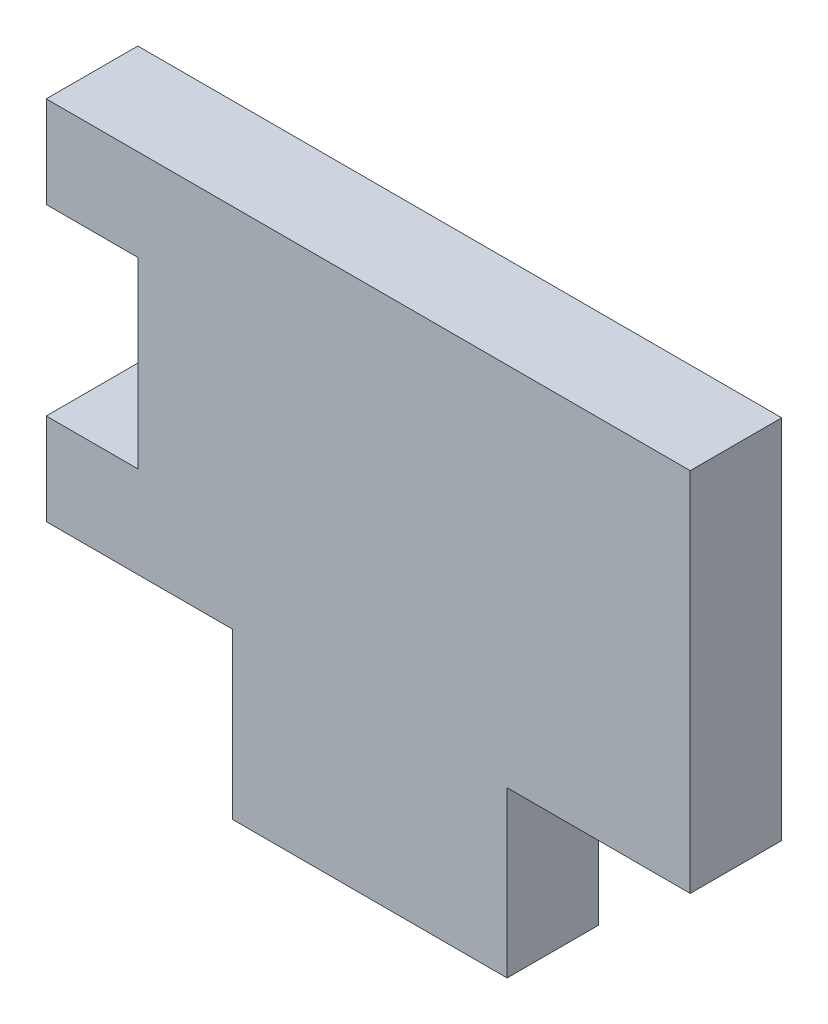
ISO-10303-21;
HEADER;
FILE_DESCRIPTION(('STEP AP214'),'2;1');
FILE_NAME('part.step','',(''),(''),'','','');
FILE_SCHEMA(('AUTOMOTIVE_DESIGN { 1 0 10303 214 1 1 1 1 }'));
ENDSEC;
DATA;
#1=APPLICATION_CONTEXT('core data for automotive mechanical design processes');
#2=APPLICATION_PROTOCOL_DEFINITION('international standard','automotive_design',2000,#1);
#3=PRODUCT_CONTEXT('',#1,'mechanical');
#4=PRODUCT('Part','Part','',(#3));
#5=PRODUCT_RELATED_PRODUCT_CATEGORY('part','',(#4));
#6=PRODUCT_DEFINITION_FORMATION('','',#4);
#7=PRODUCT_DEFINITION_CONTEXT('part definition',#1,'design');
#8=PRODUCT_DEFINITION('design','',#6,#7);
#9=PRODUCT_DEFINITION_SHAPE('','',#8);
#10=(LENGTH_UNIT() NAMED_UNIT(*) SI_UNIT(.MILLI.,.METRE.));
#11=(NAMED_UNIT(*) PLANE_ANGLE_UNIT() SI_UNIT($,.RADIAN.));
#12=(NAMED_UNIT(*) SI_UNIT($,.STERADIAN.) SOLID_ANGLE_UNIT());
#13=UNCERTAINTY_MEASURE_WITH_UNIT(LENGTH_MEASURE(1.E-05),#10,'distance_accuracy_value','');
#14=(GEOMETRIC_REPRESENTATION_CONTEXT(3) GLOBAL_UNCERTAINTY_ASSIGNED_CONTEXT((#13)) GLOBAL_UNIT_ASSIGNED_CONTEXT((#10,
#11,#12)) REPRESENTATION_CONTEXT('',''));
#15=CARTESIAN_POINT('',(0.,0.,0.));
#16=DIRECTION('',(0.,0.,1.));
#17=DIRECTION('',(1.,0.,0.));
#18=AXIS2_PLACEMENT_3D('',#15,#16,#17);
#19=CARTESIAN_POINT('',(34.9999999999996,2.93744717172161,5.));
#20=DIRECTION('',(-1.,0.,0.));
#21=DIRECTION('',(0.,0.,1.));
#22=AXIS2_PLACEMENT_3D('',#19,#20,#21);
#23=PLANE('',#22);
#24=DIRECTION('',(0.,1.,0.));
#25=VECTOR('',#24,1.);
#26=CARTESIAN_POINT('',(34.9999999999996,2.93744717172161,0.));
#27=LINE('',#26,#25);
#28=CARTESIAN_POINT('',(34.9999999999996,2.93744717172161,0.));
#29=VERTEX_POINT('',#28);
#30=CARTESIAN_POINT('',(34.9999999999996,22.9374471717216,0.));
#31=VERTEX_POINT('',#30);
#32=EDGE_CURVE('E165',#29,#31,#27,.T.);
#33=ORIENTED_EDGE('',*,*,#32,.T.);
#34=DIRECTION('',(0.,0.,-1.));
#35=VECTOR('',#34,1.);
#36=CARTESIAN_POINT('',(34.9999999999996,22.9374471717216,5.));
#37=LINE('',#36,#35);
#38=CARTESIAN_POINT('',(34.9999999999996,22.9374471717216,5.));
#39=VERTEX_POINT('',#38);
#40=EDGE_CURVE('E11',#39,#31,#37,.T.);
#41=ORIENTED_EDGE('',*,*,#40,.F.);
#42=DIRECTION('',(0.,1.,0.));
#43=VECTOR('',#42,1.);
#44=CARTESIAN_POINT('',(34.9999999999996,2.93744717172161,5.));
#45=LINE('',#44,#43);
#46=CARTESIAN_POINT('',(34.9999999999996,2.93744717172161,5.));
#47=VERTEX_POINT('',#46);
#48=EDGE_CURVE('E188',#47,#39,#45,.T.);
#49=ORIENTED_EDGE('',*,*,#48,.F.);
#50=DIRECTION('',(0.,0.,-1.));
#51=VECTOR('',#50,1.);
#52=CARTESIAN_POINT('',(34.9999999999996,2.93744717172161,5.));
#53=LINE('',#52,#51);
#54=EDGE_CURVE('E161',#47,#29,#53,.T.);
#55=ORIENTED_EDGE('',*,*,#54,.T.);
#56=EDGE_LOOP('',(#33,#41,#49,#55));
#57=FACE_BOUND('',#56,.T.);
#58=ADVANCED_FACE('F45',(#57),#23,.F.);
#59=CARTESIAN_POINT('',(-0.17398532670764,22.9374471717216,5.));
#60=DIRECTION('',(0.,-1.,0.));
#61=DIRECTION('',(0.,0.,-1.));
#62=AXIS2_PLACEMENT_3D('',#59,#60,#61);
#63=PLANE('',#62);
#64=DIRECTION('',(-1.,0.,0.));
#65=VECTOR('',#64,1.);
#66=CARTESIAN_POINT('',(-0.17398532670764,22.9374471717216,0.));
#67=LINE('',#66,#65);
#68=CARTESIAN_POINT('',(-0.17398532670764,22.9374471717216,0.));
#69=VERTEX_POINT('',#68);
#70=EDGE_CURVE('E168',#31,#69,#67,.T.);
#71=ORIENTED_EDGE('',*,*,#70,.T.);
#72=DIRECTION('',(0.,0.,-1.));
#73=VECTOR('',#72,1.);
#74=CARTESIAN_POINT('',(-0.17398532670764,22.9374471717216,5.));
#75=LINE('',#74,#73);
#76=CARTESIAN_POINT('',(-0.17398532670764,22.9374471717216,5.));
#77=VERTEX_POINT('',#76);
#78=EDGE_CURVE('E53',#77,#69,#75,.T.);
#79=ORIENTED_EDGE('',*,*,#78,.F.);
#80=DIRECTION('',(-1.,0.,0.));
#81=VECTOR('',#80,1.);
#82=CARTESIAN_POINT('',(-0.17398532670764,22.9374471717216,5.));
#83=LINE('',#82,#81);
#84=EDGE_CURVE('E116',#39,#77,#83,.T.);
#85=ORIENTED_EDGE('',*,*,#84,.F.);
#86=ORIENTED_EDGE('',*,*,#40,.T.);
#87=EDGE_LOOP('',(#71,#79,#85,#86));
#88=FACE_BOUND('',#87,.T.);
#89=ADVANCED_FACE('F265',(#88),#63,.F.);
#90=CARTESIAN_POINT('',(-0.17398532670764,17.9374471717216,5.));
#91=DIRECTION('',(1.,0.,0.));
#92=DIRECTION('',(0.,0.,-1.));
#93=AXIS2_PLACEMENT_3D('',#90,#91,#92);
#94=PLANE('',#93);
#95=DIRECTION('',(0.,-1.,0.));
#96=VECTOR('',#95,1.);
#97=CARTESIAN_POINT('',(-0.17398532670764,17.9374471717216,0.));
#98=LINE('',#97,#96);
#99=CARTESIAN_POINT('',(-0.17398532670764,17.9374471717216,0.));
#100=VERTEX_POINT('',#99);
#101=EDGE_CURVE('E170',#69,#100,#98,.T.);
#102=ORIENTED_EDGE('',*,*,#101,.T.);
#103=DIRECTION('',(0.,0.,-1.));
#104=VECTOR('',#103,1.);
#105=CARTESIAN_POINT('',(-0.17398532670764,17.9374471717216,5.));
#106=LINE('',#105,#104);
#107=CARTESIAN_POINT('',(-0.17398532670764,17.9374471717216,5.));
#108=VERTEX_POINT('',#107);
#109=EDGE_CURVE('E207',#108,#100,#106,.T.);
#110=ORIENTED_EDGE('',*,*,#109,.F.);
#111=DIRECTION('',(0.,-1.,0.));
#112=VECTOR('',#111,1.);
#113=CARTESIAN_POINT('',(-0.17398532670764,17.9374471717216,5.));
#114=LINE('',#113,#112);
#115=EDGE_CURVE('E215',#77,#108,#114,.T.);
#116=ORIENTED_EDGE('',*,*,#115,.F.);
#117=ORIENTED_EDGE('',*,*,#78,.T.);
#118=EDGE_LOOP('',(#102,#110,#116,#117));
#119=FACE_BOUND('',#118,.T.);
#120=ADVANCED_FACE('F213',(#119),#94,.F.);
#121=CARTESIAN_POINT('',(4.82601467329236,17.9374471717216,5.));
#122=DIRECTION('',(0.,1.,0.));
#123=DIRECTION('',(0.,0.,1.));
#124=AXIS2_PLACEMENT_3D('',#121,#122,#123);
#125=PLANE('',#124);
#126=DIRECTION('',(1.,0.,0.));
#127=VECTOR('',#126,1.);
#128=CARTESIAN_POINT('',(4.82601467329236,17.9374471717216,0.));
#129=LINE('',#128,#127);
#130=CARTESIAN_POINT('',(4.82601467329236,17.9374471717216,0.));
#131=VERTEX_POINT('',#130);
#132=EDGE_CURVE('E172',#100,#131,#129,.T.);
#133=ORIENTED_EDGE('',*,*,#132,.T.);
#134=DIRECTION('',(0.,0.,-1.));
#135=VECTOR('',#134,1.);
#136=CARTESIAN_POINT('',(4.82601467329236,17.9374471717216,5.));
#137=LINE('',#136,#135);
#138=CARTESIAN_POINT('',(4.82601467329236,17.9374471717216,5.));
#139=VERTEX_POINT('',#138);
#140=EDGE_CURVE('E204',#139,#131,#137,.T.);
#141=ORIENTED_EDGE('',*,*,#140,.F.);
#142=DIRECTION('',(1.,0.,0.));
#143=VECTOR('',#142,1.);
#144=CARTESIAN_POINT('',(4.82601467329236,17.9374471717216,5.));
#145=LINE('',#144,#143);
#146=EDGE_CURVE('E232',#108,#139,#145,.T.);
#147=ORIENTED_EDGE('',*,*,#146,.F.);
#148=ORIENTED_EDGE('',*,*,#109,.T.);
#149=EDGE_LOOP('',(#133,#141,#147,#148));
#150=FACE_BOUND('',#149,.T.);
#151=ADVANCED_FACE('F223',(#150),#125,.F.);
#152=CARTESIAN_POINT('',(4.82601467329236,7.93744717172161,5.));
#153=DIRECTION('',(1.,0.,0.));
#154=DIRECTION('',(0.,1.,0.));
#155=AXIS2_PLACEMENT_3D('',#152,#153,#154);
#156=PLANE('',#155);
#157=DIRECTION('',(0.,-1.,0.));
#158=VECTOR('',#157,1.);
#159=CARTESIAN_POINT('',(4.82601467329236,7.93744717172161,0.));
#160=LINE('',#159,#158);
#161=CARTESIAN_POINT('',(4.82601467329236,7.93744717172161,0.));
#162=VERTEX_POINT('',#161);
#163=EDGE_CURVE('E175',#131,#162,#160,.T.);
#164=ORIENTED_EDGE('',*,*,#163,.T.);
#165=DIRECTION('',(0.,0.,-1.));
#166=VECTOR('',#165,1.);
#167=CARTESIAN_POINT('',(4.82601467329236,7.93744717172161,5.));
#168=LINE('',#167,#166);
#169=CARTESIAN_POINT('',(4.82601467329236,7.93744717172161,5.));
#170=VERTEX_POINT('',#169);
#171=EDGE_CURVE('E201',#170,#162,#168,.T.);
#172=ORIENTED_EDGE('',*,*,#171,.F.);
#173=DIRECTION('',(0.,-1.,0.));
#174=VECTOR('',#173,1.);
#175=CARTESIAN_POINT('',(4.82601467329236,17.9374471717216,5.));
#176=LINE('',#175,#174);
#177=EDGE_CURVE('E229',#139,#170,#176,.T.);
#178=ORIENTED_EDGE('',*,*,#177,.F.);
#179=ORIENTED_EDGE('',*,*,#140,.T.);
#180=EDGE_LOOP('',(#164,#172,#178,#179));
#181=FACE_BOUND('',#180,.T.);
#182=ADVANCED_FACE('F227',(#181),#156,.F.);
#183=CARTESIAN_POINT('',(4.82601467329236,7.93744717172161,5.));
#184=DIRECTION('',(0.,-1.,0.));
#185=DIRECTION('',(0.,0.,-1.));
#186=AXIS2_PLACEMENT_3D('',#183,#184,#185);
#187=PLANE('',#186);
#188=DIRECTION('',(-1.,0.,0.));
#189=VECTOR('',#188,1.);
#190=CARTESIAN_POINT('',(4.82601467329236,7.93744717172161,0.));
#191=LINE('',#190,#189);
#192=CARTESIAN_POINT('',(-0.17398532670764,7.93744717172161,0.));
#193=VERTEX_POINT('',#192);
#194=EDGE_CURVE('E177',#162,#193,#191,.T.);
#195=ORIENTED_EDGE('',*,*,#194,.T.);
#196=DIRECTION('',(0.,0.,-1.));
#197=VECTOR('',#196,1.);
#198=CARTESIAN_POINT('',(-0.17398532670764,7.93744717172161,5.));
#199=LINE('',#198,#197);
#200=CARTESIAN_POINT('',(-0.17398532670764,7.93744717172161,5.));
#201=VERTEX_POINT('',#200);
#202=EDGE_CURVE('E198',#201,#193,#199,.T.);
#203=ORIENTED_EDGE('',*,*,#202,.F.);
#204=DIRECTION('',(-1.,0.,0.));
#205=VECTOR('',#204,1.);
#206=CARTESIAN_POINT('',(4.82601467329236,7.93744717172161,5.));
#207=LINE('',#206,#205);
#208=EDGE_CURVE('E231',#170,#201,#207,.T.);
#209=ORIENTED_EDGE('',*,*,#208,.F.);
#210=ORIENTED_EDGE('',*,*,#171,.T.);
#211=EDGE_LOOP('',(#195,#203,#209,#210));
#212=FACE_BOUND('',#211,.T.);
#213=ADVANCED_FACE('F278',(#212),#187,.F.);
#214=CARTESIAN_POINT('',(-0.17398532670764,2.93744717172161,5.));
#215=DIRECTION('',(1.,0.,0.));
#216=DIRECTION('',(0.,0.,-1.));
#217=AXIS2_PLACEMENT_3D('',#214,#215,#216);
#218=PLANE('',#217);
#219=DIRECTION('',(0.,-1.,0.));
#220=VECTOR('',#219,1.);
#221=CARTESIAN_POINT('',(-0.17398532670764,2.93744717172161,0.));
#222=LINE('',#221,#220);
#223=CARTESIAN_POINT('',(-0.17398532670764,2.93744717172161,0.));
#224=VERTEX_POINT('',#223);
#225=EDGE_CURVE('E179',#193,#224,#222,.T.);
#226=ORIENTED_EDGE('',*,*,#225,.T.);
#227=DIRECTION('',(0.,0.,-1.));
#228=VECTOR('',#227,1.);
#229=CARTESIAN_POINT('',(-0.17398532670764,2.93744717172161,5.));
#230=LINE('',#229,#228);
#231=CARTESIAN_POINT('',(-0.17398532670764,2.93744717172161,5.));
#232=VERTEX_POINT('',#231);
#233=EDGE_CURVE('E195',#232,#224,#230,.T.);
#234=ORIENTED_EDGE('',*,*,#233,.F.);
#235=DIRECTION('',(0.,-1.,0.));
#236=VECTOR('',#235,1.);
#237=CARTESIAN_POINT('',(-0.17398532670764,2.93744717172161,5.));
#238=LINE('',#237,#236);
#239=EDGE_CURVE('E234',#201,#232,#238,.T.);
#240=ORIENTED_EDGE('',*,*,#239,.F.);
#241=ORIENTED_EDGE('',*,*,#202,.T.);
#242=EDGE_LOOP('',(#226,#234,#240,#241));
#243=FACE_BOUND('',#242,.T.);
#244=ADVANCED_FACE('F281',(#243),#218,.F.);
#245=CARTESIAN_POINT('',(-0.17398532670764,2.93744717172161,5.));
#246=DIRECTION('',(0.,1.,0.));
#247=DIRECTION('',(0.,0.,1.));
#248=AXIS2_PLACEMENT_3D('',#245,#246,#247);
#249=PLANE('',#248);
#250=DIRECTION('',(1.,0.,0.));
#251=VECTOR('',#250,1.);
#252=CARTESIAN_POINT('',(-0.17398532670764,2.93744717172161,0.));
#253=LINE('',#252,#251);
#254=CARTESIAN_POINT('',(9.99999999999963,2.93744717172161,0.));
#255=VERTEX_POINT('',#254);
#256=EDGE_CURVE('E181',#224,#255,#253,.T.);
#257=ORIENTED_EDGE('',*,*,#256,.T.);
#258=DIRECTION('',(0.,0.,-1.));
#259=VECTOR('',#258,1.);
#260=CARTESIAN_POINT('',(9.99999999999963,2.93744717172161,5.));
#261=LINE('',#260,#259);
#262=CARTESIAN_POINT('',(9.99999999999963,2.93744717172161,5.));
#263=VERTEX_POINT('',#262);
#264=EDGE_CURVE('E192',#263,#255,#261,.T.);
#265=ORIENTED_EDGE('',*,*,#264,.F.);
#266=DIRECTION('',(1.,0.,0.));
#267=VECTOR('',#266,1.);
#268=CARTESIAN_POINT('',(-0.17398532670764,2.93744717172161,5.));
#269=LINE('',#268,#267);
#270=EDGE_CURVE('E240',#232,#263,#269,.T.);
#271=ORIENTED_EDGE('',*,*,#270,.F.);
#272=ORIENTED_EDGE('',*,*,#233,.T.);
#273=EDGE_LOOP('',(#257,#265,#271,#272));
#274=FACE_BOUND('',#273,.T.);
#275=ADVANCED_FACE('F246',(#274),#249,.F.);
#276=CARTESIAN_POINT('',(9.99999999999963,2.93744717172161,5.));
#277=DIRECTION('',(1.,0.,0.));
#278=DIRECTION('',(0.,1.,0.));
#279=AXIS2_PLACEMENT_3D('',#276,#277,#278);
#280=PLANE('',#279);
#281=DIRECTION('',(0.,-1.,0.));
#282=VECTOR('',#281,1.);
#283=CARTESIAN_POINT('',(9.99999999999963,2.93744717172161,0.));
#284=LINE('',#283,#282);
#285=CARTESIAN_POINT('',(9.99999999999964,-6.06255282827839,0.));
#286=VERTEX_POINT('',#285);
#287=EDGE_CURVE('E183',#255,#286,#284,.T.);
#288=ORIENTED_EDGE('',*,*,#287,.T.);
#289=DIRECTION('',(0.,0.,-1.));
#290=VECTOR('',#289,1.);
#291=CARTESIAN_POINT('',(9.99999999999964,-6.06255282827839,5.));
#292=LINE('',#291,#290);
#293=CARTESIAN_POINT('',(9.99999999999964,-6.06255282827839,5.));
#294=VERTEX_POINT('',#293);
#295=EDGE_CURVE('E156',#294,#286,#292,.T.);
#296=ORIENTED_EDGE('',*,*,#295,.F.);
#297=DIRECTION('',(0.,-1.,0.));
#298=VECTOR('',#297,1.);
#299=CARTESIAN_POINT('',(9.99999999999963,2.93744717172161,5.));
#300=LINE('',#299,#298);
#301=EDGE_CURVE('E147',#263,#294,#300,.T.);
#302=ORIENTED_EDGE('',*,*,#301,.F.);
#303=ORIENTED_EDGE('',*,*,#264,.T.);
#304=EDGE_LOOP('',(#288,#296,#302,#303));
#305=FACE_BOUND('',#304,.T.);
#306=ADVANCED_FACE('F250',(#305),#280,.F.);
#307=CARTESIAN_POINT('',(9.99999999999964,-6.06255282827839,5.));
#308=DIRECTION('',(0.,1.,0.));
#309=DIRECTION('',(0.,0.,1.));
#310=AXIS2_PLACEMENT_3D('',#307,#308,#309);
#311=PLANE('',#310);
#312=DIRECTION('',(1.,0.,0.));
#313=VECTOR('',#312,1.);
#314=CARTESIAN_POINT('',(9.99999999999964,-6.06255282827839,0.));
#315=LINE('',#314,#313);
#316=CARTESIAN_POINT('',(24.9999999999996,-6.06255282827839,0.));
#317=VERTEX_POINT('',#316);
#318=EDGE_CURVE('E155',#286,#317,#315,.T.);
#319=ORIENTED_EDGE('',*,*,#318,.T.);
#320=DIRECTION('',(0.,0.,-1.));
#321=VECTOR('',#320,1.);
#322=CARTESIAN_POINT('',(24.9999999999996,-6.06255282827839,5.));
#323=LINE('',#322,#321);
#324=CARTESIAN_POINT('',(24.9999999999996,-6.06255282827839,5.));
#325=VERTEX_POINT('',#324);
#326=EDGE_CURVE('E152',#325,#317,#323,.T.);
#327=ORIENTED_EDGE('',*,*,#326,.F.);
#328=DIRECTION('',(1.,0.,0.));
#329=VECTOR('',#328,1.);
#330=CARTESIAN_POINT('',(9.99999999999964,-6.06255282827839,5.));
#331=LINE('',#330,#329);
#332=EDGE_CURVE('E141',#294,#325,#331,.T.);
#333=ORIENTED_EDGE('',*,*,#332,.F.);
#334=ORIENTED_EDGE('',*,*,#295,.T.);
#335=EDGE_LOOP('',(#319,#327,#333,#334));
#336=FACE_BOUND('',#335,.T.);
#337=ADVANCED_FACE('F153',(#336),#311,.F.);
#338=CARTESIAN_POINT('',(24.9999999999996,2.93744717172161,5.));
#339=DIRECTION('',(-1.,0.,0.));
#340=DIRECTION('',(0.,0.,1.));
#341=AXIS2_PLACEMENT_3D('',#338,#339,#340);
#342=PLANE('',#341);
#343=DIRECTION('',(0.,1.,0.));
#344=VECTOR('',#343,1.);
#345=CARTESIAN_POINT('',(24.9999999999996,2.93744717172161,0.));
#346=LINE('',#345,#344);
#347=CARTESIAN_POINT('',(24.9999999999996,2.93744717172161,0.));
#348=VERTEX_POINT('',#347);
#349=EDGE_CURVE('E102',#317,#348,#346,.T.);
#350=ORIENTED_EDGE('',*,*,#349,.T.);
#351=DIRECTION('',(0.,0.,-1.));
#352=VECTOR('',#351,1.);
#353=CARTESIAN_POINT('',(24.9999999999996,2.93744717172161,5.));
#354=LINE('',#353,#352);
#355=CARTESIAN_POINT('',(24.9999999999996,2.93744717172161,5.));
#356=VERTEX_POINT('',#355);
#357=EDGE_CURVE('E157',#356,#348,#354,.T.);
#358=ORIENTED_EDGE('',*,*,#357,.F.);
#359=DIRECTION('',(0.,1.,0.));
#360=VECTOR('',#359,1.);
#361=CARTESIAN_POINT('',(24.9999999999996,2.93744717172161,5.));
#362=LINE('',#361,#360);
#363=EDGE_CURVE('E145',#325,#356,#362,.T.);
#364=ORIENTED_EDGE('',*,*,#363,.F.);
#365=ORIENTED_EDGE('',*,*,#326,.T.);
#366=EDGE_LOOP('',(#350,#358,#364,#365));
#367=FACE_BOUND('',#366,.T.);
#368=ADVANCED_FACE('F159',(#367),#342,.F.);
#369=CARTESIAN_POINT('',(24.9999999999996,2.93744717172161,5.));
#370=DIRECTION('',(0.,1.,0.));
#371=DIRECTION('',(0.,0.,1.));
#372=AXIS2_PLACEMENT_3D('',#369,#370,#371);
#373=PLANE('',#372);
#374=DIRECTION('',(1.,0.,0.));
#375=VECTOR('',#374,1.);
#376=CARTESIAN_POINT('',(24.9999999999996,2.93744717172161,0.));
#377=LINE('',#376,#375);
#378=EDGE_CURVE('E108',#348,#29,#377,.T.);
#379=ORIENTED_EDGE('',*,*,#378,.T.);
#380=ORIENTED_EDGE('',*,*,#54,.F.);
#381=DIRECTION('',(1.,0.,0.));
#382=VECTOR('',#381,1.);
#383=CARTESIAN_POINT('',(24.9999999999996,2.93744717172161,5.));
#384=LINE('',#383,#382);
#385=EDGE_CURVE('E61',#356,#47,#384,.T.);
#386=ORIENTED_EDGE('',*,*,#385,.F.);
#387=ORIENTED_EDGE('',*,*,#357,.T.);
#388=EDGE_LOOP('',(#379,#380,#386,#387));
#389=FACE_BOUND('',#388,.T.);
#390=ADVANCED_FACE('F254',(#389),#373,.F.);
#391=CARTESIAN_POINT('',(0.,0.,5.));
#392=DIRECTION('',(0.,0.,-1.));
#393=DIRECTION('',(-1.,0.,0.));
#394=AXIS2_PLACEMENT_3D('',#391,#392,#393);
#395=PLANE('',#394);
#396=ORIENTED_EDGE('',*,*,#48,.T.);
#397=ORIENTED_EDGE('',*,*,#84,.T.);
#398=ORIENTED_EDGE('',*,*,#115,.T.);
#399=ORIENTED_EDGE('',*,*,#146,.T.);
#400=ORIENTED_EDGE('',*,*,#177,.T.);
#401=ORIENTED_EDGE('',*,*,#208,.T.);
#402=ORIENTED_EDGE('',*,*,#239,.T.);
#403=ORIENTED_EDGE('',*,*,#270,.T.);
#404=ORIENTED_EDGE('',*,*,#301,.T.);
#405=ORIENTED_EDGE('',*,*,#332,.T.);
#406=ORIENTED_EDGE('',*,*,#363,.T.);
#407=ORIENTED_EDGE('',*,*,#385,.T.);
#408=EDGE_LOOP('',(#396,#397,#398,#399,#400,#401,#402,#403,#404,#405,#406,#407));
#409=FACE_BOUND('',#408,.T.);
#410=ADVANCED_FACE('F143',(#409),#395,.F.);
#411=CARTESIAN_POINT('',(0.,0.,0.));
#412=DIRECTION('',(0.,0.,-1.));
#413=DIRECTION('',(-1.,0.,0.));
#414=AXIS2_PLACEMENT_3D('',#411,#412,#413);
#415=PLANE('',#414);
#416=ORIENTED_EDGE('',*,*,#32,.F.);
#417=ORIENTED_EDGE('',*,*,#378,.F.);
#418=ORIENTED_EDGE('',*,*,#349,.F.);
#419=ORIENTED_EDGE('',*,*,#318,.F.);
#420=ORIENTED_EDGE('',*,*,#287,.F.);
#421=ORIENTED_EDGE('',*,*,#256,.F.);
#422=ORIENTED_EDGE('',*,*,#225,.F.);
#423=ORIENTED_EDGE('',*,*,#194,.F.);
#424=ORIENTED_EDGE('',*,*,#163,.F.);
#425=ORIENTED_EDGE('',*,*,#132,.F.);
#426=ORIENTED_EDGE('',*,*,#101,.F.);
#427=ORIENTED_EDGE('',*,*,#70,.F.);
#428=EDGE_LOOP('',(#416,#417,#418,#419,#420,#421,#422,#423,#424,#425,#426,#427));
#429=FACE_BOUND('',#428,.T.);
#430=ADVANCED_FACE('F219',(#429),#415,.T.);
#431=CLOSED_SHELL('',(#58,#89,#120,#151,#182,#213,#244,#275,#306,#337,#368,#390,#410,#430));
#432=MANIFOLD_SOLID_BREP('B2',#431);
#433=ADVANCED_BREP_SHAPE_REPRESENTATION('',(#18,#432),#14);
#434=SHAPE_DEFINITION_REPRESENTATION(#9,#433);
ENDSEC;
END-ISO-10303-21;
